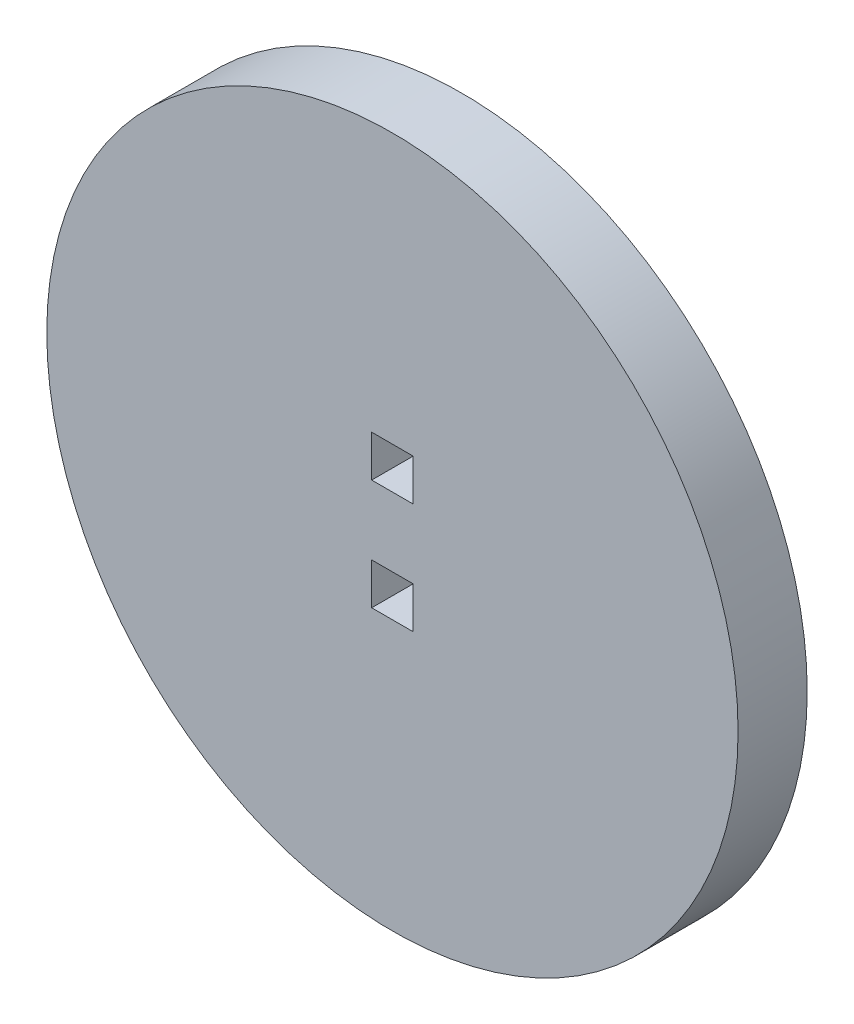
ISO-10303-21;
HEADER;
FILE_DESCRIPTION(('STEP AP214'),'2;1');
FILE_NAME('part.step','',(''),(''),'','','');
FILE_SCHEMA(('AUTOMOTIVE_DESIGN { 1 0 10303 214 1 1 1 1 }'));
ENDSEC;
DATA;
#1=APPLICATION_CONTEXT('core data for automotive mechanical design processes');
#2=APPLICATION_PROTOCOL_DEFINITION('international standard','automotive_design',2000,#1);
#3=PRODUCT_CONTEXT('',#1,'mechanical');
#4=PRODUCT('Part','Part','',(#3));
#5=PRODUCT_RELATED_PRODUCT_CATEGORY('part','',(#4));
#6=PRODUCT_DEFINITION_FORMATION('','',#4);
#7=PRODUCT_DEFINITION_CONTEXT('part definition',#1,'design');
#8=PRODUCT_DEFINITION('design','',#6,#7);
#9=PRODUCT_DEFINITION_SHAPE('','',#8);
#10=(LENGTH_UNIT() NAMED_UNIT(*) SI_UNIT(.MILLI.,.METRE.));
#11=(NAMED_UNIT(*) PLANE_ANGLE_UNIT() SI_UNIT($,.RADIAN.));
#12=(NAMED_UNIT(*) SI_UNIT($,.STERADIAN.) SOLID_ANGLE_UNIT());
#13=UNCERTAINTY_MEASURE_WITH_UNIT(LENGTH_MEASURE(1.E-05),#10,'distance_accuracy_value','');
#14=(GEOMETRIC_REPRESENTATION_CONTEXT(3) GLOBAL_UNCERTAINTY_ASSIGNED_CONTEXT((#13)) GLOBAL_UNIT_ASSIGNED_CONTEXT((#10,
#11,#12)) REPRESENTATION_CONTEXT('',''));
#15=CARTESIAN_POINT('',(0.,0.,0.));
#16=DIRECTION('',(0.,0.,1.));
#17=DIRECTION('',(1.,0.,0.));
#18=AXIS2_PLACEMENT_3D('',#15,#16,#17);
#19=CARTESIAN_POINT('',(0.,0.,5.));
#20=DIRECTION('',(0.,0.,-1.));
#21=DIRECTION('',(-1.,0.,0.));
#22=AXIS2_PLACEMENT_3D('',#19,#20,#21);
#23=CYLINDRICAL_SURFACE('',#22,25.);
#24=CARTESIAN_POINT('',(0.,0.,5.));
#25=DIRECTION('',(0.,0.,1.));
#26=DIRECTION('',(1.,0.,0.));
#27=AXIS2_PLACEMENT_3D('',#24,#25,#26);
#28=CIRCLE('',#27,25.);
#29=CARTESIAN_POINT('',(25.,0.,5.));
#30=VERTEX_POINT('',#29);
#31=EDGE_CURVE('E11',#30,#30,#28,.T.);
#32=ORIENTED_EDGE('',*,*,#31,.F.);
#33=EDGE_LOOP('',(#32));
#34=FACE_BOUND('',#33,.T.);
#35=CARTESIAN_POINT('',(0.,0.,0.));
#36=DIRECTION('',(0.,0.,1.));
#37=DIRECTION('',(1.,0.,0.));
#38=AXIS2_PLACEMENT_3D('',#35,#36,#37);
#39=CIRCLE('',#38,25.);
#40=CARTESIAN_POINT('',(25.,0.,0.));
#41=VERTEX_POINT('',#40);
#42=EDGE_CURVE('E36',#41,#41,#39,.T.);
#43=ORIENTED_EDGE('',*,*,#42,.T.);
#44=EDGE_LOOP('',(#43));
#45=FACE_BOUND('',#44,.T.);
#46=ADVANCED_FACE('F33',(#34,#45),#23,.T.);
#47=CARTESIAN_POINT('',(0.,0.,5.));
#48=DIRECTION('',(0.,0.,1.));
#49=DIRECTION('',(1.,0.,0.));
#50=AXIS2_PLACEMENT_3D('',#47,#48,#49);
#51=PLANE('',#50);
#52=DIRECTION('',(0.,1.,0.));
#53=VECTOR('',#52,1.);
#54=CARTESIAN_POINT('',(1.5,-2.5,5.));
#55=LINE('',#54,#53);
#56=CARTESIAN_POINT('',(1.5,-5.5,5.));
#57=VERTEX_POINT('',#56);
#58=CARTESIAN_POINT('',(1.5,-2.5,5.));
#59=VERTEX_POINT('',#58);
#60=EDGE_CURVE('E47',#57,#59,#55,.T.);
#61=ORIENTED_EDGE('',*,*,#60,.F.);
#62=DIRECTION('',(1.,0.,0.));
#63=VECTOR('',#62,1.);
#64=CARTESIAN_POINT('',(-1.5,-5.5,5.));
#65=LINE('',#64,#63);
#66=CARTESIAN_POINT('',(-1.5,-5.5,5.));
#67=VERTEX_POINT('',#66);
#68=EDGE_CURVE('E118',#67,#57,#65,.T.);
#69=ORIENTED_EDGE('',*,*,#68,.F.);
#70=DIRECTION('',(0.,-1.,0.));
#71=VECTOR('',#70,1.);
#72=CARTESIAN_POINT('',(-1.5,-2.5,5.));
#73=LINE('',#72,#71);
#74=CARTESIAN_POINT('',(-1.5,-2.5,5.));
#75=VERTEX_POINT('',#74);
#76=EDGE_CURVE('E121',#75,#67,#73,.T.);
#77=ORIENTED_EDGE('',*,*,#76,.F.);
#78=DIRECTION('',(-1.,0.,0.));
#79=VECTOR('',#78,1.);
#80=CARTESIAN_POINT('',(-1.5,-2.5,5.));
#81=LINE('',#80,#79);
#82=EDGE_CURVE('E127',#59,#75,#81,.T.);
#83=ORIENTED_EDGE('',*,*,#82,.F.);
#84=EDGE_LOOP('',(#61,#69,#77,#83));
#85=FACE_BOUND('',#84,.T.);
#86=DIRECTION('',(0.,1.,0.));
#87=VECTOR('',#86,1.);
#88=CARTESIAN_POINT('',(1.5,5.5,5.));
#89=LINE('',#88,#87);
#90=CARTESIAN_POINT('',(1.5,2.5,5.));
#91=VERTEX_POINT('',#90);
#92=CARTESIAN_POINT('',(1.5,5.5,5.));
#93=VERTEX_POINT('',#92);
#94=EDGE_CURVE('E55',#91,#93,#89,.T.);
#95=ORIENTED_EDGE('',*,*,#94,.F.);
#96=DIRECTION('',(1.,0.,0.));
#97=VECTOR('',#96,1.);
#98=CARTESIAN_POINT('',(-1.5,2.5,5.));
#99=LINE('',#98,#97);
#100=CARTESIAN_POINT('',(-1.5,2.5,5.));
#101=VERTEX_POINT('',#100);
#102=EDGE_CURVE('E141',#101,#91,#99,.T.);
#103=ORIENTED_EDGE('',*,*,#102,.F.);
#104=DIRECTION('',(0.,-1.,0.));
#105=VECTOR('',#104,1.);
#106=CARTESIAN_POINT('',(-1.5,5.5,5.));
#107=LINE('',#106,#105);
#108=CARTESIAN_POINT('',(-1.5,5.5,5.));
#109=VERTEX_POINT('',#108);
#110=EDGE_CURVE('E155',#109,#101,#107,.T.);
#111=ORIENTED_EDGE('',*,*,#110,.F.);
#112=DIRECTION('',(-1.,0.,0.));
#113=VECTOR('',#112,1.);
#114=CARTESIAN_POINT('',(-1.5,5.5,5.));
#115=LINE('',#114,#113);
#116=EDGE_CURVE('E152',#93,#109,#115,.T.);
#117=ORIENTED_EDGE('',*,*,#116,.F.);
#118=EDGE_LOOP('',(#95,#103,#111,#117));
#119=FACE_BOUND('',#118,.T.);
#120=ORIENTED_EDGE('',*,*,#31,.T.);
#121=EDGE_LOOP('',(#120));
#122=FACE_BOUND('',#121,.T.);
#123=ADVANCED_FACE('F173',(#85,#119,#122),#51,.T.);
#124=CARTESIAN_POINT('',(0.,0.,0.));
#125=DIRECTION('',(0.,0.,1.));
#126=DIRECTION('',(1.,0.,0.));
#127=AXIS2_PLACEMENT_3D('',#124,#125,#126);
#128=PLANE('',#127);
#129=DIRECTION('',(1.,0.,0.));
#130=VECTOR('',#129,1.);
#131=CARTESIAN_POINT('',(-1.5,-5.5,0.));
#132=LINE('',#131,#130);
#133=CARTESIAN_POINT('',(-1.5,-5.5,0.));
#134=VERTEX_POINT('',#133);
#135=CARTESIAN_POINT('',(1.5,-5.5,0.));
#136=VERTEX_POINT('',#135);
#137=EDGE_CURVE('E105',#134,#136,#132,.T.);
#138=ORIENTED_EDGE('',*,*,#137,.T.);
#139=DIRECTION('',(0.,1.,0.));
#140=VECTOR('',#139,1.);
#141=CARTESIAN_POINT('',(1.5,-2.5,0.));
#142=LINE('',#141,#140);
#143=CARTESIAN_POINT('',(1.5,-2.5,0.));
#144=VERTEX_POINT('',#143);
#145=EDGE_CURVE('E99',#136,#144,#142,.T.);
#146=ORIENTED_EDGE('',*,*,#145,.T.);
#147=DIRECTION('',(-1.,0.,0.));
#148=VECTOR('',#147,1.);
#149=CARTESIAN_POINT('',(-1.5,-2.5,0.));
#150=LINE('',#149,#148);
#151=CARTESIAN_POINT('',(-1.5,-2.5,0.));
#152=VERTEX_POINT('',#151);
#153=EDGE_CURVE('E109',#144,#152,#150,.T.);
#154=ORIENTED_EDGE('',*,*,#153,.T.);
#155=DIRECTION('',(0.,-1.,0.));
#156=VECTOR('',#155,1.);
#157=CARTESIAN_POINT('',(-1.5,-2.5,0.));
#158=LINE('',#157,#156);
#159=EDGE_CURVE('E113',#152,#134,#158,.T.);
#160=ORIENTED_EDGE('',*,*,#159,.T.);
#161=EDGE_LOOP('',(#138,#146,#154,#160));
#162=FACE_BOUND('',#161,.T.);
#163=DIRECTION('',(1.,0.,0.));
#164=VECTOR('',#163,1.);
#165=CARTESIAN_POINT('',(-1.5,2.5,0.));
#166=LINE('',#165,#164);
#167=CARTESIAN_POINT('',(-1.5,2.5,0.));
#168=VERTEX_POINT('',#167);
#169=CARTESIAN_POINT('',(1.5,2.5,0.));
#170=VERTEX_POINT('',#169);
#171=EDGE_CURVE('E147',#168,#170,#166,.T.);
#172=ORIENTED_EDGE('',*,*,#171,.T.);
#173=DIRECTION('',(0.,1.,0.));
#174=VECTOR('',#173,1.);
#175=CARTESIAN_POINT('',(1.5,5.5,0.));
#176=LINE('',#175,#174);
#177=CARTESIAN_POINT('',(1.5,5.5,0.));
#178=VERTEX_POINT('',#177);
#179=EDGE_CURVE('E137',#170,#178,#176,.T.);
#180=ORIENTED_EDGE('',*,*,#179,.T.);
#181=DIRECTION('',(-1.,0.,0.));
#182=VECTOR('',#181,1.);
#183=CARTESIAN_POINT('',(-1.5,5.5,0.));
#184=LINE('',#183,#182);
#185=CARTESIAN_POINT('',(-1.5,5.5,0.));
#186=VERTEX_POINT('',#185);
#187=EDGE_CURVE('E140',#178,#186,#184,.T.);
#188=ORIENTED_EDGE('',*,*,#187,.T.);
#189=DIRECTION('',(0.,-1.,0.));
#190=VECTOR('',#189,1.);
#191=CARTESIAN_POINT('',(-1.5,5.5,0.));
#192=LINE('',#191,#190);
#193=EDGE_CURVE('E144',#186,#168,#192,.T.);
#194=ORIENTED_EDGE('',*,*,#193,.T.);
#195=EDGE_LOOP('',(#172,#180,#188,#194));
#196=FACE_BOUND('',#195,.T.);
#197=ORIENTED_EDGE('',*,*,#42,.F.);
#198=EDGE_LOOP('',(#197));
#199=FACE_BOUND('',#198,.T.);
#200=ADVANCED_FACE('F115',(#162,#196,#199),#128,.F.);
#201=CARTESIAN_POINT('',(1.5,5.5,0.));
#202=DIRECTION('',(1.,0.,0.));
#203=DIRECTION('',(0.,1.,0.));
#204=AXIS2_PLACEMENT_3D('',#201,#202,#203);
#205=PLANE('',#204);
#206=ORIENTED_EDGE('',*,*,#94,.T.);
#207=DIRECTION('',(0.,0.,1.));
#208=VECTOR('',#207,1.);
#209=CARTESIAN_POINT('',(1.5,5.5,0.));
#210=LINE('',#209,#208);
#211=EDGE_CURVE('E150',#178,#93,#210,.T.);
#212=ORIENTED_EDGE('',*,*,#211,.F.);
#213=ORIENTED_EDGE('',*,*,#179,.F.);
#214=DIRECTION('',(0.,0.,1.));
#215=VECTOR('',#214,1.);
#216=CARTESIAN_POINT('',(1.5,2.5,0.));
#217=LINE('',#216,#215);
#218=EDGE_CURVE('E128',#170,#91,#217,.T.);
#219=ORIENTED_EDGE('',*,*,#218,.T.);
#220=EDGE_LOOP('',(#206,#212,#213,#219));
#221=FACE_BOUND('',#220,.T.);
#222=ADVANCED_FACE('F180',(#221),#205,.F.);
#223=CARTESIAN_POINT('',(-1.5,2.5,0.));
#224=DIRECTION('',(0.,-1.,0.));
#225=DIRECTION('',(0.,0.,-1.));
#226=AXIS2_PLACEMENT_3D('',#223,#224,#225);
#227=PLANE('',#226);
#228=ORIENTED_EDGE('',*,*,#102,.T.);
#229=ORIENTED_EDGE('',*,*,#218,.F.);
#230=ORIENTED_EDGE('',*,*,#171,.F.);
#231=DIRECTION('',(0.,0.,1.));
#232=VECTOR('',#231,1.);
#233=CARTESIAN_POINT('',(-1.5,2.5,0.));
#234=LINE('',#233,#232);
#235=EDGE_CURVE('E161',#168,#101,#234,.T.);
#236=ORIENTED_EDGE('',*,*,#235,.T.);
#237=EDGE_LOOP('',(#228,#229,#230,#236));
#238=FACE_BOUND('',#237,.T.);
#239=ADVANCED_FACE('F182',(#238),#227,.F.);
#240=CARTESIAN_POINT('',(-1.5,5.5,0.));
#241=DIRECTION('',(-1.,0.,0.));
#242=DIRECTION('',(0.,-1.,0.));
#243=AXIS2_PLACEMENT_3D('',#240,#241,#242);
#244=PLANE('',#243);
#245=ORIENTED_EDGE('',*,*,#110,.T.);
#246=ORIENTED_EDGE('',*,*,#235,.F.);
#247=ORIENTED_EDGE('',*,*,#193,.F.);
#248=DIRECTION('',(0.,0.,1.));
#249=VECTOR('',#248,1.);
#250=CARTESIAN_POINT('',(-1.5,5.5,0.));
#251=LINE('',#250,#249);
#252=EDGE_CURVE('E163',#186,#109,#251,.T.);
#253=ORIENTED_EDGE('',*,*,#252,.T.);
#254=EDGE_LOOP('',(#245,#246,#247,#253));
#255=FACE_BOUND('',#254,.T.);
#256=ADVANCED_FACE('F177',(#255),#244,.F.);
#257=CARTESIAN_POINT('',(-1.5,5.5,0.));
#258=DIRECTION('',(0.,1.,0.));
#259=DIRECTION('',(-1.,0.,0.));
#260=AXIS2_PLACEMENT_3D('',#257,#258,#259);
#261=PLANE('',#260);
#262=ORIENTED_EDGE('',*,*,#116,.T.);
#263=ORIENTED_EDGE('',*,*,#252,.F.);
#264=ORIENTED_EDGE('',*,*,#187,.F.);
#265=ORIENTED_EDGE('',*,*,#211,.T.);
#266=EDGE_LOOP('',(#262,#263,#264,#265));
#267=FACE_BOUND('',#266,.T.);
#268=ADVANCED_FACE('F168',(#267),#261,.F.);
#269=CARTESIAN_POINT('',(1.5,-2.5,0.));
#270=DIRECTION('',(1.,0.,0.));
#271=DIRECTION('',(0.,1.,0.));
#272=AXIS2_PLACEMENT_3D('',#269,#270,#271);
#273=PLANE('',#272);
#274=ORIENTED_EDGE('',*,*,#60,.T.);
#275=DIRECTION('',(0.,0.,1.));
#276=VECTOR('',#275,1.);
#277=CARTESIAN_POINT('',(1.5,-2.5,0.));
#278=LINE('',#277,#276);
#279=EDGE_CURVE('E95',#144,#59,#278,.T.);
#280=ORIENTED_EDGE('',*,*,#279,.F.);
#281=ORIENTED_EDGE('',*,*,#145,.F.);
#282=DIRECTION('',(0.,0.,1.));
#283=VECTOR('',#282,1.);
#284=CARTESIAN_POINT('',(1.5,-5.5,0.));
#285=LINE('',#284,#283);
#286=EDGE_CURVE('E132',#136,#57,#285,.T.);
#287=ORIENTED_EDGE('',*,*,#286,.T.);
#288=EDGE_LOOP('',(#274,#280,#281,#287));
#289=FACE_BOUND('',#288,.T.);
#290=ADVANCED_FACE('F97',(#289),#273,.F.);
#291=CARTESIAN_POINT('',(-1.5,-5.5,0.));
#292=DIRECTION('',(0.,-1.,0.));
#293=DIRECTION('',(0.,0.,-1.));
#294=AXIS2_PLACEMENT_3D('',#291,#292,#293);
#295=PLANE('',#294);
#296=ORIENTED_EDGE('',*,*,#68,.T.);
#297=ORIENTED_EDGE('',*,*,#286,.F.);
#298=ORIENTED_EDGE('',*,*,#137,.F.);
#299=DIRECTION('',(0.,0.,1.));
#300=VECTOR('',#299,1.);
#301=CARTESIAN_POINT('',(-1.5,-5.5,0.));
#302=LINE('',#301,#300);
#303=EDGE_CURVE('E134',#134,#67,#302,.T.);
#304=ORIENTED_EDGE('',*,*,#303,.T.);
#305=EDGE_LOOP('',(#296,#297,#298,#304));
#306=FACE_BOUND('',#305,.T.);
#307=ADVANCED_FACE('F211',(#306),#295,.F.);
#308=CARTESIAN_POINT('',(-1.5,-2.5,0.));
#309=DIRECTION('',(-1.,0.,0.));
#310=DIRECTION('',(0.,-1.,0.));
#311=AXIS2_PLACEMENT_3D('',#308,#309,#310);
#312=PLANE('',#311);
#313=ORIENTED_EDGE('',*,*,#76,.T.);
#314=ORIENTED_EDGE('',*,*,#303,.F.);
#315=ORIENTED_EDGE('',*,*,#159,.F.);
#316=DIRECTION('',(0.,0.,1.));
#317=VECTOR('',#316,1.);
#318=CARTESIAN_POINT('',(-1.5,-2.5,0.));
#319=LINE('',#318,#317);
#320=EDGE_CURVE('E104',#152,#75,#319,.T.);
#321=ORIENTED_EDGE('',*,*,#320,.T.);
#322=EDGE_LOOP('',(#313,#314,#315,#321));
#323=FACE_BOUND('',#322,.T.);
#324=ADVANCED_FACE('F215',(#323),#312,.F.);
#325=CARTESIAN_POINT('',(-1.5,-2.5,0.));
#326=DIRECTION('',(0.,1.,0.));
#327=DIRECTION('',(0.,0.,1.));
#328=AXIS2_PLACEMENT_3D('',#325,#326,#327);
#329=PLANE('',#328);
#330=ORIENTED_EDGE('',*,*,#82,.T.);
#331=ORIENTED_EDGE('',*,*,#320,.F.);
#332=ORIENTED_EDGE('',*,*,#153,.F.);
#333=ORIENTED_EDGE('',*,*,#279,.T.);
#334=EDGE_LOOP('',(#330,#331,#332,#333));
#335=FACE_BOUND('',#334,.T.);
#336=ADVANCED_FACE('F110',(#335),#329,.F.);
#337=CLOSED_SHELL('',(#46,#123,#200,#222,#239,#256,#268,#290,#307,#324,#336));
#338=MANIFOLD_SOLID_BREP('B2',#337);
#339=ADVANCED_BREP_SHAPE_REPRESENTATION('',(#18,#338),#14);
#340=SHAPE_DEFINITION_REPRESENTATION(#9,#339);
ENDSEC;
END-ISO-10303-21;
